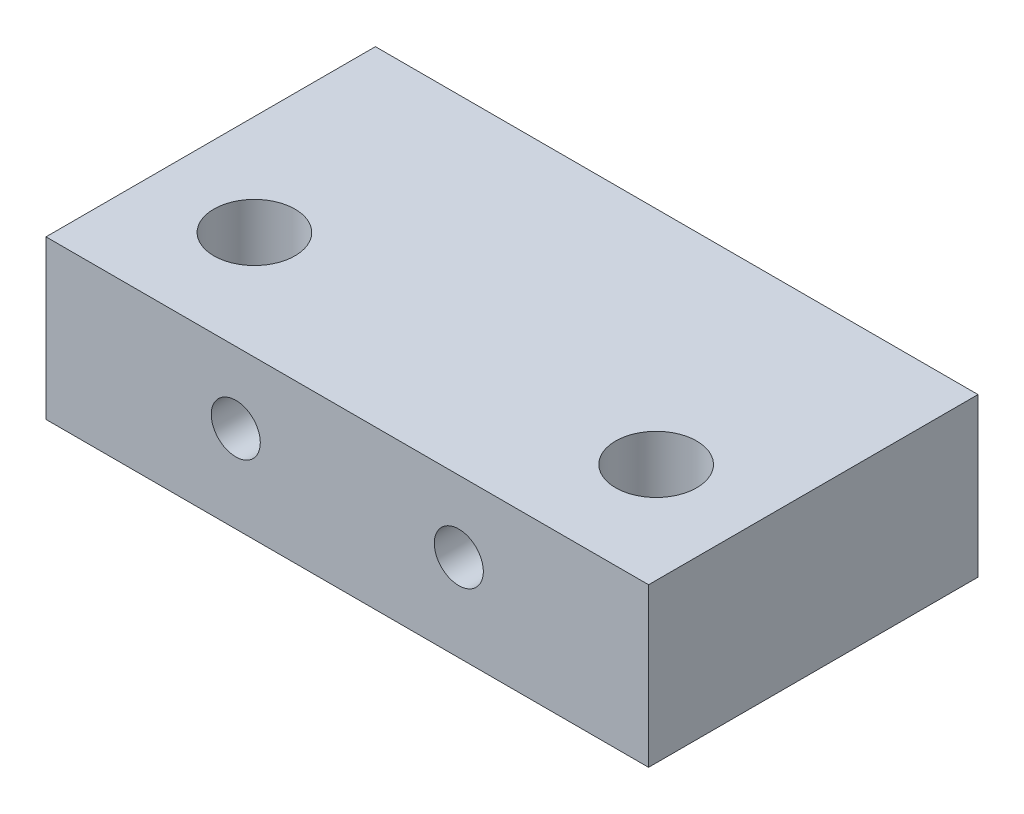
ISO-10303-21;
HEADER;
FILE_DESCRIPTION(('STEP AP214'),'2;1');
FILE_NAME('part.step','',(''),(''),'','','');
FILE_SCHEMA(('AUTOMOTIVE_DESIGN { 1 0 10303 214 1 1 1 1 }'));
ENDSEC;
DATA;
#1=APPLICATION_CONTEXT('core data for automotive mechanical design processes');
#2=APPLICATION_PROTOCOL_DEFINITION('international standard','automotive_design',2000,#1);
#3=PRODUCT_CONTEXT('',#1,'mechanical');
#4=PRODUCT('Part','Part','',(#3));
#5=PRODUCT_RELATED_PRODUCT_CATEGORY('part','',(#4));
#6=PRODUCT_DEFINITION_FORMATION('','',#4);
#7=PRODUCT_DEFINITION_CONTEXT('part definition',#1,'design');
#8=PRODUCT_DEFINITION('design','',#6,#7);
#9=PRODUCT_DEFINITION_SHAPE('','',#8);
#10=(LENGTH_UNIT() NAMED_UNIT(*) SI_UNIT(.MILLI.,.METRE.));
#11=(NAMED_UNIT(*) PLANE_ANGLE_UNIT() SI_UNIT($,.RADIAN.));
#12=(NAMED_UNIT(*) SI_UNIT($,.STERADIAN.) SOLID_ANGLE_UNIT());
#13=UNCERTAINTY_MEASURE_WITH_UNIT(LENGTH_MEASURE(1.E-05),#10,'distance_accuracy_value','');
#14=(GEOMETRIC_REPRESENTATION_CONTEXT(3) GLOBAL_UNCERTAINTY_ASSIGNED_CONTEXT((#13)) GLOBAL_UNIT_ASSIGNED_CONTEXT((#10,
#11,#12)) REPRESENTATION_CONTEXT('',''));
#15=CARTESIAN_POINT('',(0.,0.,0.));
#16=DIRECTION('',(0.,0.,1.));
#17=DIRECTION('',(1.,0.,0.));
#18=AXIS2_PLACEMENT_3D('',#15,#16,#17);
#19=CARTESIAN_POINT('',(0.,10.,0.));
#20=DIRECTION('',(0.,1.,0.));
#21=DIRECTION('',(0.,0.,1.));
#22=AXIS2_PLACEMENT_3D('',#19,#20,#21);
#23=PLANE('',#22);
#24=CARTESIAN_POINT('',(-31.75,10.,-6.828));
#25=DIRECTION('',(0.,1.,0.));
#26=DIRECTION('',(0.,0.,1.));
#27=AXIS2_PLACEMENT_3D('',#24,#25,#26);
#28=CIRCLE('',#27,2.564);
#29=CARTESIAN_POINT('',(-31.75,10.,-4.264));
#30=VERTEX_POINT('',#29);
#31=EDGE_CURVE('E111',#30,#30,#28,.T.);
#32=ORIENTED_EDGE('',*,*,#31,.F.);
#33=EDGE_LOOP('',(#32));
#34=FACE_BOUND('',#33,.T.);
#35=DIRECTION('',(0.,0.,1.));
#36=VECTOR('',#35,1.);
#37=CARTESIAN_POINT('',(-38.1,10.,-20.828));
#38=LINE('',#37,#36);
#39=CARTESIAN_POINT('',(-38.1,10.,-20.828));
#40=VERTEX_POINT('',#39);
#41=CARTESIAN_POINT('',(-38.1,10.,0.));
#42=VERTEX_POINT('',#41);
#43=EDGE_CURVE('E96',#40,#42,#38,.T.);
#44=ORIENTED_EDGE('',*,*,#43,.T.);
#45=DIRECTION('',(1.,0.,0.));
#46=VECTOR('',#45,1.);
#47=CARTESIAN_POINT('',(-38.1,10.,0.));
#48=LINE('',#47,#46);
#49=CARTESIAN_POINT('',(0.,10.,0.));
#50=VERTEX_POINT('',#49);
#51=EDGE_CURVE('E91',#42,#50,#48,.T.);
#52=ORIENTED_EDGE('',*,*,#51,.T.);
#53=DIRECTION('',(0.,0.,-1.));
#54=VECTOR('',#53,1.);
#55=CARTESIAN_POINT('',(0.,10.,-20.828));
#56=LINE('',#55,#54);
#57=CARTESIAN_POINT('',(0.,10.,-20.828));
#58=VERTEX_POINT('',#57);
#59=EDGE_CURVE('E94',#50,#58,#56,.T.);
#60=ORIENTED_EDGE('',*,*,#59,.T.);
#61=DIRECTION('',(-1.,0.,0.));
#62=VECTOR('',#61,1.);
#63=CARTESIAN_POINT('',(-38.1,10.,-20.828));
#64=LINE('',#63,#62);
#65=EDGE_CURVE('E61',#58,#40,#64,.T.);
#66=ORIENTED_EDGE('',*,*,#65,.T.);
#67=EDGE_LOOP('',(#44,#52,#60,#66));
#68=FACE_BOUND('',#67,.T.);
#69=CARTESIAN_POINT('',(-6.35,10.,-6.828));
#70=DIRECTION('',(0.,1.,0.));
#71=DIRECTION('',(0.,0.,-1.));
#72=AXIS2_PLACEMENT_3D('',#69,#70,#71);
#73=CIRCLE('',#72,2.564);
#74=CARTESIAN_POINT('',(-6.35,10.,-9.392));
#75=VERTEX_POINT('',#74);
#76=EDGE_CURVE('E126',#75,#75,#73,.T.);
#77=ORIENTED_EDGE('',*,*,#76,.F.);
#78=EDGE_LOOP('',(#77));
#79=FACE_BOUND('',#78,.T.);
#80=ADVANCED_FACE('F44',(#34,#68,#79),#23,.T.);
#81=CARTESIAN_POINT('',(0.,0.,0.));
#82=DIRECTION('',(0.,1.,0.));
#83=DIRECTION('',(0.,0.,1.));
#84=AXIS2_PLACEMENT_3D('',#81,#82,#83);
#85=PLANE('',#84);
#86=DIRECTION('',(0.,0.,1.));
#87=VECTOR('',#86,1.);
#88=CARTESIAN_POINT('',(-38.1,0.,-20.828));
#89=LINE('',#88,#87);
#90=CARTESIAN_POINT('',(-38.1,0.,-20.828));
#91=VERTEX_POINT('',#90);
#92=CARTESIAN_POINT('',(-38.1,0.,0.));
#93=VERTEX_POINT('',#92);
#94=EDGE_CURVE('E108',#91,#93,#89,.T.);
#95=ORIENTED_EDGE('',*,*,#94,.F.);
#96=DIRECTION('',(-1.,0.,0.));
#97=VECTOR('',#96,1.);
#98=CARTESIAN_POINT('',(-38.1,0.,-20.828));
#99=LINE('',#98,#97);
#100=CARTESIAN_POINT('',(0.,0.,-20.828));
#101=VERTEX_POINT('',#100);
#102=EDGE_CURVE('E84',#101,#91,#99,.T.);
#103=ORIENTED_EDGE('',*,*,#102,.F.);
#104=DIRECTION('',(0.,0.,-1.));
#105=VECTOR('',#104,1.);
#106=CARTESIAN_POINT('',(0.,0.,-20.828));
#107=LINE('',#106,#105);
#108=CARTESIAN_POINT('',(0.,0.,0.));
#109=VERTEX_POINT('',#108);
#110=EDGE_CURVE('E78',#109,#101,#107,.T.);
#111=ORIENTED_EDGE('',*,*,#110,.F.);
#112=DIRECTION('',(1.,0.,0.));
#113=VECTOR('',#112,1.);
#114=CARTESIAN_POINT('',(-38.1,0.,0.));
#115=LINE('',#114,#113);
#116=EDGE_CURVE('E100',#93,#109,#115,.T.);
#117=ORIENTED_EDGE('',*,*,#116,.F.);
#118=EDGE_LOOP('',(#95,#103,#111,#117));
#119=FACE_BOUND('',#118,.T.);
#120=CARTESIAN_POINT('',(-31.75,0.,-6.828));
#121=DIRECTION('',(0.,1.,0.));
#122=DIRECTION('',(0.,0.,1.));
#123=AXIS2_PLACEMENT_3D('',#120,#121,#122);
#124=CIRCLE('',#123,2.564);
#125=CARTESIAN_POINT('',(-31.75,0.,-4.264));
#126=VERTEX_POINT('',#125);
#127=EDGE_CURVE('E123',#126,#126,#124,.T.);
#128=ORIENTED_EDGE('',*,*,#127,.T.);
#129=EDGE_LOOP('',(#128));
#130=FACE_BOUND('',#129,.T.);
#131=CARTESIAN_POINT('',(-6.35,0.,-6.828));
#132=DIRECTION('',(0.,1.,0.));
#133=DIRECTION('',(0.,0.,-1.));
#134=AXIS2_PLACEMENT_3D('',#131,#132,#133);
#135=CIRCLE('',#134,2.564);
#136=CARTESIAN_POINT('',(-6.35,0.,-9.392));
#137=VERTEX_POINT('',#136);
#138=EDGE_CURVE('E129',#137,#137,#135,.T.);
#139=ORIENTED_EDGE('',*,*,#138,.T.);
#140=EDGE_LOOP('',(#139));
#141=FACE_BOUND('',#140,.T.);
#142=ADVANCED_FACE('F119',(#119,#130,#141),#85,.F.);
#143=CARTESIAN_POINT('',(-38.1,10.,-20.828));
#144=DIRECTION('',(1.,0.,0.));
#145=DIRECTION('',(0.,0.,-1.));
#146=AXIS2_PLACEMENT_3D('',#143,#144,#145);
#147=PLANE('',#146);
#148=ORIENTED_EDGE('',*,*,#94,.T.);
#149=DIRECTION('',(0.,-1.,0.));
#150=VECTOR('',#149,1.);
#151=CARTESIAN_POINT('',(-38.1,10.,0.));
#152=LINE('',#151,#150);
#153=EDGE_CURVE('E11',#42,#93,#152,.T.);
#154=ORIENTED_EDGE('',*,*,#153,.F.);
#155=ORIENTED_EDGE('',*,*,#43,.F.);
#156=DIRECTION('',(0.,-1.,0.));
#157=VECTOR('',#156,1.);
#158=CARTESIAN_POINT('',(-38.1,10.,-20.828));
#159=LINE('',#158,#157);
#160=EDGE_CURVE('E104',#40,#91,#159,.T.);
#161=ORIENTED_EDGE('',*,*,#160,.T.);
#162=EDGE_LOOP('',(#148,#154,#155,#161));
#163=FACE_BOUND('',#162,.T.);
#164=ADVANCED_FACE('F46',(#163),#147,.F.);
#165=CARTESIAN_POINT('',(-38.1,10.,0.));
#166=DIRECTION('',(0.,0.,-1.));
#167=DIRECTION('',(-1.,0.,0.));
#168=AXIS2_PLACEMENT_3D('',#165,#166,#167);
#169=PLANE('',#168);
#170=CARTESIAN_POINT('',(-26.1,5.5,0.));
#171=DIRECTION('',(0.,0.,1.));
#172=DIRECTION('',(1.,0.,0.));
#173=AXIS2_PLACEMENT_3D('',#170,#171,#172);
#174=CIRCLE('',#173,1.55);
#175=CARTESIAN_POINT('',(-24.55,5.5,0.));
#176=VERTEX_POINT('',#175);
#177=EDGE_CURVE('E141',#176,#176,#174,.T.);
#178=ORIENTED_EDGE('',*,*,#177,.F.);
#179=EDGE_LOOP('',(#178));
#180=FACE_BOUND('',#179,.T.);
#181=CARTESIAN_POINT('',(-12.,5.5,0.));
#182=DIRECTION('',(0.,0.,1.));
#183=DIRECTION('',(-1.,0.,0.));
#184=AXIS2_PLACEMENT_3D('',#181,#182,#183);
#185=CIRCLE('',#184,1.55);
#186=CARTESIAN_POINT('',(-13.55,5.5,0.));
#187=VERTEX_POINT('',#186);
#188=EDGE_CURVE('E138',#187,#187,#185,.T.);
#189=ORIENTED_EDGE('',*,*,#188,.F.);
#190=EDGE_LOOP('',(#189));
#191=FACE_BOUND('',#190,.T.);
#192=ORIENTED_EDGE('',*,*,#116,.T.);
#193=DIRECTION('',(0.,-1.,0.));
#194=VECTOR('',#193,1.);
#195=CARTESIAN_POINT('',(0.,10.,0.));
#196=LINE('',#195,#194);
#197=EDGE_CURVE('E53',#50,#109,#196,.T.);
#198=ORIENTED_EDGE('',*,*,#197,.F.);
#199=ORIENTED_EDGE('',*,*,#51,.F.);
#200=ORIENTED_EDGE('',*,*,#153,.T.);
#201=EDGE_LOOP('',(#192,#198,#199,#200));
#202=FACE_BOUND('',#201,.T.);
#203=ADVANCED_FACE('F99',(#180,#191,#202),#169,.F.);
#204=CARTESIAN_POINT('',(0.,10.,-20.828));
#205=DIRECTION('',(-1.,0.,0.));
#206=DIRECTION('',(0.,0.,1.));
#207=AXIS2_PLACEMENT_3D('',#204,#205,#206);
#208=PLANE('',#207);
#209=ORIENTED_EDGE('',*,*,#110,.T.);
#210=DIRECTION('',(0.,-1.,0.));
#211=VECTOR('',#210,1.);
#212=CARTESIAN_POINT('',(0.,10.,-20.828));
#213=LINE('',#212,#211);
#214=EDGE_CURVE('E101',#58,#101,#213,.T.);
#215=ORIENTED_EDGE('',*,*,#214,.F.);
#216=ORIENTED_EDGE('',*,*,#59,.F.);
#217=ORIENTED_EDGE('',*,*,#197,.T.);
#218=EDGE_LOOP('',(#209,#215,#216,#217));
#219=FACE_BOUND('',#218,.T.);
#220=ADVANCED_FACE('F102',(#219),#208,.F.);
#221=CARTESIAN_POINT('',(-38.1,10.,-20.828));
#222=DIRECTION('',(0.,0.,1.));
#223=DIRECTION('',(1.,0.,0.));
#224=AXIS2_PLACEMENT_3D('',#221,#222,#223);
#225=PLANE('',#224);
#226=ORIENTED_EDGE('',*,*,#102,.T.);
#227=ORIENTED_EDGE('',*,*,#160,.F.);
#228=ORIENTED_EDGE('',*,*,#65,.F.);
#229=ORIENTED_EDGE('',*,*,#214,.T.);
#230=EDGE_LOOP('',(#226,#227,#228,#229));
#231=FACE_BOUND('',#230,.T.);
#232=ADVANCED_FACE('F116',(#231),#225,.F.);
#233=CARTESIAN_POINT('',(-31.75,10.,-6.828));
#234=DIRECTION('',(0.,-1.,0.));
#235=DIRECTION('',(0.,0.,-1.));
#236=AXIS2_PLACEMENT_3D('',#233,#234,#235);
#237=CYLINDRICAL_SURFACE('',#236,2.564);
#238=ORIENTED_EDGE('',*,*,#31,.T.);
#239=EDGE_LOOP('',(#238));
#240=FACE_BOUND('',#239,.T.);
#241=ORIENTED_EDGE('',*,*,#127,.F.);
#242=EDGE_LOOP('',(#241));
#243=FACE_BOUND('',#242,.T.);
#244=ADVANCED_FACE('F171',(#240,#243),#237,.F.);
#245=CARTESIAN_POINT('',(-6.35,10.,-6.828));
#246=DIRECTION('',(0.,-1.,0.));
#247=DIRECTION('',(0.,0.,-1.));
#248=AXIS2_PLACEMENT_3D('',#245,#246,#247);
#249=CYLINDRICAL_SURFACE('',#248,2.564);
#250=ORIENTED_EDGE('',*,*,#76,.T.);
#251=EDGE_LOOP('',(#250));
#252=FACE_BOUND('',#251,.T.);
#253=ORIENTED_EDGE('',*,*,#138,.F.);
#254=EDGE_LOOP('',(#253));
#255=FACE_BOUND('',#254,.T.);
#256=ADVANCED_FACE('F162',(#252,#255),#249,.F.);
#257=CARTESIAN_POINT('',(-12.,5.5,-10.));
#258=DIRECTION('',(0.,0.,1.));
#259=DIRECTION('',(1.,0.,0.));
#260=AXIS2_PLACEMENT_3D('',#257,#258,#259);
#261=CYLINDRICAL_SURFACE('',#260,1.55);
#262=CARTESIAN_POINT('',(-12.,5.5,-10.));
#263=DIRECTION('',(0.,0.,1.));
#264=DIRECTION('',(-1.,0.,0.));
#265=AXIS2_PLACEMENT_3D('',#262,#263,#264);
#266=CIRCLE('',#265,1.55);
#267=CARTESIAN_POINT('',(-13.55,5.5,-10.));
#268=VERTEX_POINT('',#267);
#269=EDGE_CURVE('E135',#268,#268,#266,.T.);
#270=ORIENTED_EDGE('',*,*,#269,.F.);
#271=EDGE_LOOP('',(#270));
#272=FACE_BOUND('',#271,.T.);
#273=ORIENTED_EDGE('',*,*,#188,.T.);
#274=EDGE_LOOP('',(#273));
#275=FACE_BOUND('',#274,.T.);
#276=ADVANCED_FACE('F160',(#272,#275),#261,.F.);
#277=CARTESIAN_POINT('',(-12.,5.5,-10.));
#278=DIRECTION('',(0.,0.,-1.));
#279=DIRECTION('',(-1.,0.,0.));
#280=AXIS2_PLACEMENT_3D('',#277,#278,#279);
#281=PLANE('',#280);
#282=ORIENTED_EDGE('',*,*,#269,.T.);
#283=EDGE_LOOP('',(#282));
#284=FACE_BOUND('',#283,.T.);
#285=ADVANCED_FACE('F152',(#284),#281,.F.);
#286=CARTESIAN_POINT('',(-26.1,5.5,-10.));
#287=DIRECTION('',(0.,0.,1.));
#288=DIRECTION('',(1.,0.,0.));
#289=AXIS2_PLACEMENT_3D('',#286,#287,#288);
#290=CYLINDRICAL_SURFACE('',#289,1.55);
#291=CARTESIAN_POINT('',(-26.1,5.5,-10.));
#292=DIRECTION('',(0.,0.,1.));
#293=DIRECTION('',(1.,0.,0.));
#294=AXIS2_PLACEMENT_3D('',#291,#292,#293);
#295=CIRCLE('',#294,1.55);
#296=CARTESIAN_POINT('',(-24.55,5.5,-10.));
#297=VERTEX_POINT('',#296);
#298=EDGE_CURVE('E132',#297,#297,#295,.T.);
#299=ORIENTED_EDGE('',*,*,#298,.F.);
#300=EDGE_LOOP('',(#299));
#301=FACE_BOUND('',#300,.T.);
#302=ORIENTED_EDGE('',*,*,#177,.T.);
#303=EDGE_LOOP('',(#302));
#304=FACE_BOUND('',#303,.T.);
#305=ADVANCED_FACE('F149',(#301,#304),#290,.F.);
#306=CARTESIAN_POINT('',(-26.1,5.5,-10.));
#307=DIRECTION('',(0.,0.,1.));
#308=DIRECTION('',(1.,0.,0.));
#309=AXIS2_PLACEMENT_3D('',#306,#307,#308);
#310=PLANE('',#309);
#311=ORIENTED_EDGE('',*,*,#298,.T.);
#312=EDGE_LOOP('',(#311));
#313=FACE_BOUND('',#312,.T.);
#314=ADVANCED_FACE('F147',(#313),#310,.T.);
#315=CLOSED_SHELL('',(#80,#142,#164,#203,#220,#232,#244,#256,#276,#285,#305,#314));
#316=MANIFOLD_SOLID_BREP('B2',#315);
#317=ADVANCED_BREP_SHAPE_REPRESENTATION('',(#18,#316),#14);
#318=SHAPE_DEFINITION_REPRESENTATION(#9,#317);
ENDSEC;
END-ISO-10303-21;
